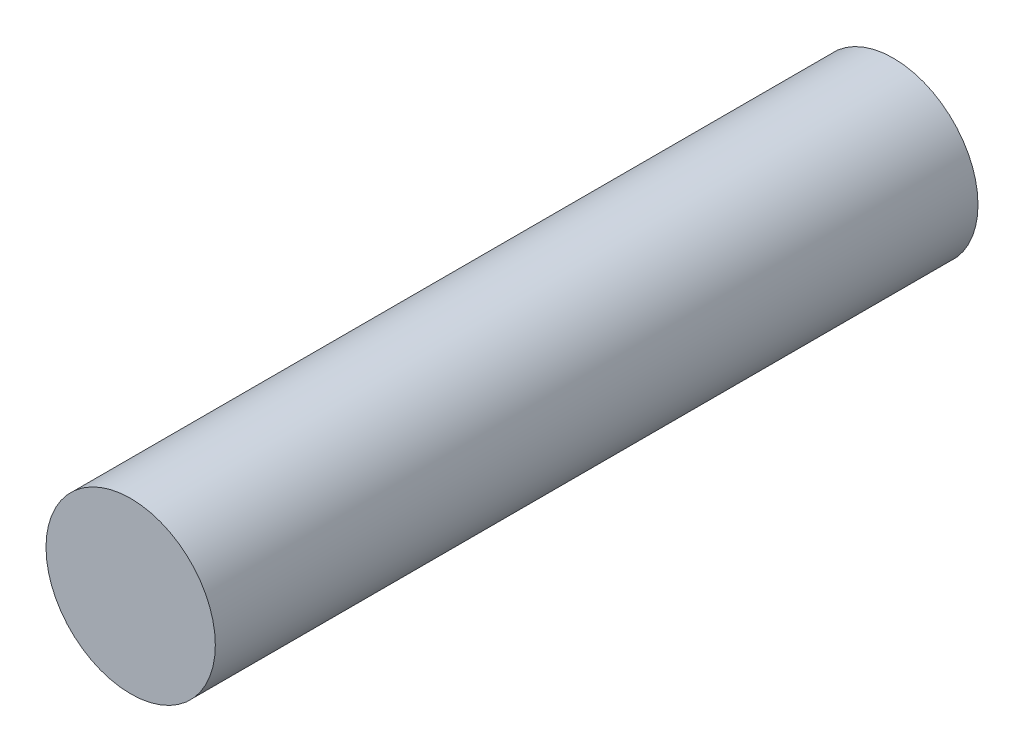
ISO-10303-21;
HEADER;
FILE_DESCRIPTION(('STEP AP214'),'2;1');
FILE_NAME('part.step','',(''),(''),'','','');
FILE_SCHEMA(('AUTOMOTIVE_DESIGN { 1 0 10303 214 1 1 1 1 }'));
ENDSEC;
DATA;
#1=APPLICATION_CONTEXT('core data for automotive mechanical design processes');
#2=APPLICATION_PROTOCOL_DEFINITION('international standard','automotive_design',2000,#1);
#3=PRODUCT_CONTEXT('',#1,'mechanical');
#4=PRODUCT('Part','Part','',(#3));
#5=PRODUCT_RELATED_PRODUCT_CATEGORY('part','',(#4));
#6=PRODUCT_DEFINITION_FORMATION('','',#4);
#7=PRODUCT_DEFINITION_CONTEXT('part definition',#1,'design');
#8=PRODUCT_DEFINITION('design','',#6,#7);
#9=PRODUCT_DEFINITION_SHAPE('','',#8);
#10=(LENGTH_UNIT() NAMED_UNIT(*) SI_UNIT(.MILLI.,.METRE.));
#11=(NAMED_UNIT(*) PLANE_ANGLE_UNIT() SI_UNIT($,.RADIAN.));
#12=(NAMED_UNIT(*) SI_UNIT($,.STERADIAN.) SOLID_ANGLE_UNIT());
#13=UNCERTAINTY_MEASURE_WITH_UNIT(LENGTH_MEASURE(1.E-05),#10,'distance_accuracy_value','');
#14=(GEOMETRIC_REPRESENTATION_CONTEXT(3) GLOBAL_UNCERTAINTY_ASSIGNED_CONTEXT((#13)) GLOBAL_UNIT_ASSIGNED_CONTEXT((#10,
#11,#12)) REPRESENTATION_CONTEXT('',''));
#15=CARTESIAN_POINT('',(0.,0.,0.));
#16=DIRECTION('',(0.,0.,1.));
#17=DIRECTION('',(1.,0.,0.));
#18=AXIS2_PLACEMENT_3D('',#15,#16,#17);
#19=CARTESIAN_POINT('',(0.,0.,14.3002));
#20=DIRECTION('',(0.,0.,-1.));
#21=DIRECTION('',(-1.,0.,0.));
#22=AXIS2_PLACEMENT_3D('',#19,#20,#21);
#23=CYLINDRICAL_SURFACE('',#22,1.5875);
#24=CARTESIAN_POINT('',(0.,0.,14.3002));
#25=DIRECTION('',(0.,0.,1.));
#26=DIRECTION('',(1.,0.,0.));
#27=AXIS2_PLACEMENT_3D('',#24,#25,#26);
#28=CIRCLE('',#27,1.5875);
#29=CARTESIAN_POINT('',(1.5875,0.,14.3002));
#30=VERTEX_POINT('',#29);
#31=EDGE_CURVE('E10',#30,#30,#28,.T.);
#32=ORIENTED_EDGE('',*,*,#31,.F.);
#33=EDGE_LOOP('',(#32));
#34=FACE_BOUND('',#33,.T.);
#35=CARTESIAN_POINT('',(0.,0.,0.));
#36=DIRECTION('',(0.,0.,1.));
#37=DIRECTION('',(1.,0.,0.));
#38=AXIS2_PLACEMENT_3D('',#35,#36,#37);
#39=CIRCLE('',#38,1.5875);
#40=CARTESIAN_POINT('',(1.5875,0.,0.));
#41=VERTEX_POINT('',#40);
#42=EDGE_CURVE('E35',#41,#41,#39,.T.);
#43=ORIENTED_EDGE('',*,*,#42,.T.);
#44=EDGE_LOOP('',(#43));
#45=FACE_BOUND('',#44,.T.);
#46=ADVANCED_FACE('F32',(#34,#45),#23,.T.);
#47=CARTESIAN_POINT('',(0.,0.,14.3002));
#48=DIRECTION('',(0.,0.,1.));
#49=DIRECTION('',(1.,0.,0.));
#50=AXIS2_PLACEMENT_3D('',#47,#48,#49);
#51=PLANE('',#50);
#52=ORIENTED_EDGE('',*,*,#31,.T.);
#53=EDGE_LOOP('',(#52));
#54=FACE_BOUND('',#53,.T.);
#55=ADVANCED_FACE('F47',(#54),#51,.T.);
#56=CARTESIAN_POINT('',(0.,0.,0.));
#57=DIRECTION('',(0.,0.,1.));
#58=DIRECTION('',(1.,0.,0.));
#59=AXIS2_PLACEMENT_3D('',#56,#57,#58);
#60=PLANE('',#59);
#61=ORIENTED_EDGE('',*,*,#42,.F.);
#62=EDGE_LOOP('',(#61));
#63=FACE_BOUND('',#62,.T.);
#64=ADVANCED_FACE('F45',(#63),#60,.F.);
#65=CLOSED_SHELL('',(#46,#55,#64));
#66=MANIFOLD_SOLID_BREP('B2',#65);
#67=ADVANCED_BREP_SHAPE_REPRESENTATION('',(#18,#66),#14);
#68=SHAPE_DEFINITION_REPRESENTATION(#9,#67);
ENDSEC;
END-ISO-10303-21;
